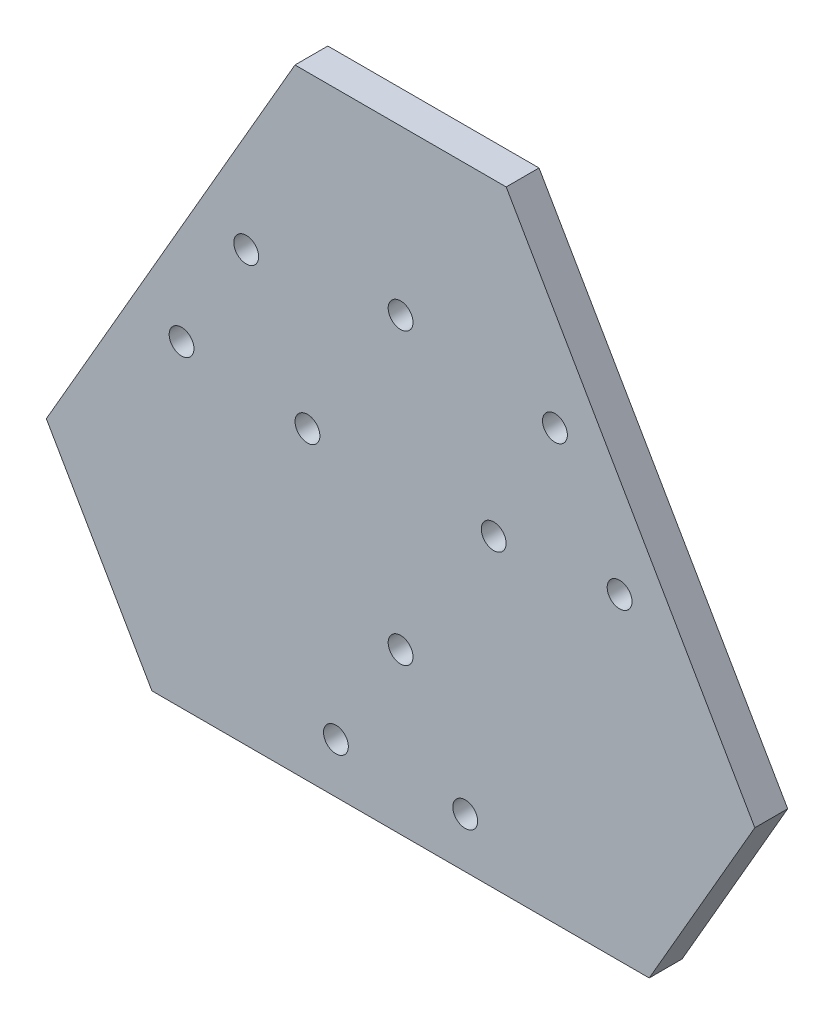
ISO-10303-21;
HEADER;
FILE_DESCRIPTION(('STEP AP214'),'2;1');
FILE_NAME('part.step','',(''),(''),'','','');
FILE_SCHEMA(('AUTOMOTIVE_DESIGN { 1 0 10303 214 1 1 1 1 }'));
ENDSEC;
DATA;
#1=APPLICATION_CONTEXT('core data for automotive mechanical design processes');
#2=APPLICATION_PROTOCOL_DEFINITION('international standard','automotive_design',2000,#1);
#3=PRODUCT_CONTEXT('',#1,'mechanical');
#4=PRODUCT('Part','Part','',(#3));
#5=PRODUCT_RELATED_PRODUCT_CATEGORY('part','',(#4));
#6=PRODUCT_DEFINITION_FORMATION('','',#4);
#7=PRODUCT_DEFINITION_CONTEXT('part definition',#1,'design');
#8=PRODUCT_DEFINITION('design','',#6,#7);
#9=PRODUCT_DEFINITION_SHAPE('','',#8);
#10=(LENGTH_UNIT() NAMED_UNIT(*) SI_UNIT(.MILLI.,.METRE.));
#11=(NAMED_UNIT(*) PLANE_ANGLE_UNIT() SI_UNIT($,.RADIAN.));
#12=(NAMED_UNIT(*) SI_UNIT($,.STERADIAN.) SOLID_ANGLE_UNIT());
#13=UNCERTAINTY_MEASURE_WITH_UNIT(LENGTH_MEASURE(1.E-05),#10,'distance_accuracy_value','');
#14=(GEOMETRIC_REPRESENTATION_CONTEXT(3) GLOBAL_UNCERTAINTY_ASSIGNED_CONTEXT((#13)) GLOBAL_UNIT_ASSIGNED_CONTEXT((#10,
#11,#12)) REPRESENTATION_CONTEXT('',''));
#15=CARTESIAN_POINT('',(0.,0.,0.));
#16=DIRECTION('',(0.,0.,1.));
#17=DIRECTION('',(1.,0.,0.));
#18=AXIS2_PLACEMENT_3D('',#15,#16,#17);
#19=CARTESIAN_POINT('',(88.9,-51.3264389309577,6.35));
#20=DIRECTION('',(0.,1.,0.));
#21=DIRECTION('',(-1.,0.,0.));
#22=AXIS2_PLACEMENT_3D('',#19,#20,#21);
#23=PLANE('',#22);
#24=DIRECTION('',(1.,0.,0.));
#25=VECTOR('',#24,1.);
#26=CARTESIAN_POINT('',(88.9,-51.3264389309577,0.));
#27=LINE('',#26,#25);
#28=CARTESIAN_POINT('',(-48.0682684614689,-51.326438930959,0.));
#29=VERTEX_POINT('',#28);
#30=CARTESIAN_POINT('',(48.0682684614717,-51.3264389309577,0.));
#31=VERTEX_POINT('',#30);
#32=EDGE_CURVE('E107',#29,#31,#27,.T.);
#33=ORIENTED_EDGE('',*,*,#32,.T.);
#34=DIRECTION('',(0.,0.,1.));
#35=VECTOR('',#34,1.);
#36=CARTESIAN_POINT('',(48.0682684614717,-51.3264389309573,0.));
#37=LINE('',#36,#35);
#38=CARTESIAN_POINT('',(48.0682684614717,-51.3264389309573,6.35));
#39=VERTEX_POINT('',#38);
#40=EDGE_CURVE('E123',#31,#39,#37,.T.);
#41=ORIENTED_EDGE('',*,*,#40,.T.);
#42=DIRECTION('',(1.,0.,0.));
#43=VECTOR('',#42,1.);
#44=CARTESIAN_POINT('',(88.9,-51.3264389309577,6.35));
#45=LINE('',#44,#43);
#46=CARTESIAN_POINT('',(-48.0682684614689,-51.326438930959,6.35));
#47=VERTEX_POINT('',#46);
#48=EDGE_CURVE('E103',#47,#39,#45,.T.);
#49=ORIENTED_EDGE('',*,*,#48,.F.);
#50=DIRECTION('',(0.,0.,1.));
#51=VECTOR('',#50,1.);
#52=CARTESIAN_POINT('',(-48.0682684614689,-51.326438930959,0.));
#53=LINE('',#52,#51);
#54=EDGE_CURVE('E116',#29,#47,#53,.T.);
#55=ORIENTED_EDGE('',*,*,#54,.F.);
#56=EDGE_LOOP('',(#33,#41,#49,#55));
#57=FACE_BOUND('',#56,.T.);
#58=ADVANCED_FACE('F33',(#57),#23,.F.);
#59=CARTESIAN_POINT('',(0.,102.652877861915,6.35));
#60=DIRECTION('',(-0.866025403784439,-0.5,0.));
#61=DIRECTION('',(0.5,-0.866025403784439,0.));
#62=AXIS2_PLACEMENT_3D('',#59,#60,#61);
#63=PLANE('',#62);
#64=DIRECTION('',(-0.5,0.866025403784439,0.));
#65=VECTOR('',#64,1.);
#66=CARTESIAN_POINT('',(0.,102.652877861915,0.));
#67=LINE('',#66,#65);
#68=CARTESIAN_POINT('',(68.484134230735,-15.9651221380849,0.));
#69=VERTEX_POINT('',#68);
#70=CARTESIAN_POINT('',(20.415865769265,67.2915610690423,0.));
#71=VERTEX_POINT('',#70);
#72=EDGE_CURVE('E104',#69,#71,#67,.T.);
#73=ORIENTED_EDGE('',*,*,#72,.T.);
#74=DIRECTION('',(0.,0.,1.));
#75=VECTOR('',#74,1.);
#76=CARTESIAN_POINT('',(20.415865769265,67.2915610690423,0.));
#77=LINE('',#76,#75);
#78=CARTESIAN_POINT('',(20.415865769265,67.2915610690423,6.35));
#79=VERTEX_POINT('',#78);
#80=EDGE_CURVE('E49',#71,#79,#77,.T.);
#81=ORIENTED_EDGE('',*,*,#80,.T.);
#82=DIRECTION('',(-0.5,0.866025403784439,0.));
#83=VECTOR('',#82,1.);
#84=CARTESIAN_POINT('',(0.,102.652877861915,6.35));
#85=LINE('',#84,#83);
#86=CARTESIAN_POINT('',(68.484134230735,-15.9651221380849,6.35));
#87=VERTEX_POINT('',#86);
#88=EDGE_CURVE('E41',#87,#79,#85,.T.);
#89=ORIENTED_EDGE('',*,*,#88,.F.);
#90=DIRECTION('',(0.,0.,1.));
#91=VECTOR('',#90,1.);
#92=CARTESIAN_POINT('',(68.484134230735,-15.9651221380849,0.));
#93=LINE('',#92,#91);
#94=EDGE_CURVE('E126',#69,#87,#93,.T.);
#95=ORIENTED_EDGE('',*,*,#94,.F.);
#96=EDGE_LOOP('',(#73,#81,#89,#95));
#97=FACE_BOUND('',#96,.T.);
#98=ADVANCED_FACE('F220',(#97),#63,.F.);
#99=CARTESIAN_POINT('',(-88.9,-51.3264389309577,6.35));
#100=DIRECTION('',(0.866025403784439,-0.5,0.));
#101=DIRECTION('',(0.5,0.866025403784439,0.));
#102=AXIS2_PLACEMENT_3D('',#99,#100,#101);
#103=PLANE('',#102);
#104=DIRECTION('',(-0.5,-0.866025403784439,0.));
#105=VECTOR('',#104,1.);
#106=CARTESIAN_POINT('',(-88.9,-51.3264389309577,6.35));
#107=LINE('',#106,#105);
#108=CARTESIAN_POINT('',(-20.415865769265,67.2915610690423,6.35));
#109=VERTEX_POINT('',#108);
#110=CARTESIAN_POINT('',(-68.4841342307339,-15.9651221380858,6.35));
#111=VERTEX_POINT('',#110);
#112=EDGE_CURVE('E11',#109,#111,#107,.T.);
#113=ORIENTED_EDGE('',*,*,#112,.F.);
#114=DIRECTION('',(0.,0.,1.));
#115=VECTOR('',#114,1.);
#116=CARTESIAN_POINT('',(-20.415865769265,67.2915610690423,0.));
#117=LINE('',#116,#115);
#118=CARTESIAN_POINT('',(-20.415865769265,67.2915610690423,0.));
#119=VERTEX_POINT('',#118);
#120=EDGE_CURVE('E87',#119,#109,#117,.T.);
#121=ORIENTED_EDGE('',*,*,#120,.F.);
#122=DIRECTION('',(-0.5,-0.866025403784439,0.));
#123=VECTOR('',#122,1.);
#124=CARTESIAN_POINT('',(-88.9,-51.3264389309577,0.));
#125=LINE('',#124,#123);
#126=CARTESIAN_POINT('',(-68.4841342307353,-15.965122138085,0.));
#127=VERTEX_POINT('',#126);
#128=EDGE_CURVE('E36',#119,#127,#125,.T.);
#129=ORIENTED_EDGE('',*,*,#128,.T.);
#130=DIRECTION('',(0.,0.,1.));
#131=VECTOR('',#130,1.);
#132=CARTESIAN_POINT('',(-68.4841342307339,-15.9651221380858,0.));
#133=LINE('',#132,#131);
#134=EDGE_CURVE('E57',#127,#111,#133,.T.);
#135=ORIENTED_EDGE('',*,*,#134,.T.);
#136=EDGE_LOOP('',(#113,#121,#129,#135));
#137=FACE_BOUND('',#136,.T.);
#138=ADVANCED_FACE('F98',(#137),#103,.F.);
#139=CARTESIAN_POINT('',(0.,0.,6.35));
#140=DIRECTION('',(0.,0.,-1.));
#141=DIRECTION('',(-1.,0.,0.));
#142=AXIS2_PLACEMENT_3D('',#139,#140,#141);
#143=PLANE('',#142);
#144=CARTESIAN_POINT('',(0.,35.6048,6.35));
#145=DIRECTION('',(0.,0.,1.));
#146=DIRECTION('',(1.,0.,0.));
#147=AXIS2_PLACEMENT_3D('',#144,#145,#146);
#148=CIRCLE('',#147,2.39999999999999);
#149=CARTESIAN_POINT('',(2.39999999999999,35.6048,6.35));
#150=VERTEX_POINT('',#149);
#151=EDGE_CURVE('E190',#150,#150,#148,.T.);
#152=ORIENTED_EDGE('',*,*,#151,.F.);
#153=EDGE_LOOP('',(#152));
#154=FACE_BOUND('',#153,.T.);
#155=CARTESIAN_POINT('',(0.,-20.3952,6.35));
#156=DIRECTION('',(0.,0.,1.));
#157=DIRECTION('',(1.,0.,0.));
#158=AXIS2_PLACEMENT_3D('',#155,#156,#157);
#159=CIRCLE('',#158,2.39999999999999);
#160=CARTESIAN_POINT('',(2.39999999999999,-20.3952,6.35));
#161=VERTEX_POINT('',#160);
#162=EDGE_CURVE('E184',#161,#161,#159,.T.);
#163=ORIENTED_EDGE('',*,*,#162,.F.);
#164=EDGE_LOOP('',(#163));
#165=FACE_BOUND('',#164,.T.);
#166=CARTESIAN_POINT('',(18.,7.6048,6.35));
#167=DIRECTION('',(0.,0.,1.));
#168=DIRECTION('',(1.,0.,0.));
#169=AXIS2_PLACEMENT_3D('',#166,#167,#168);
#170=CIRCLE('',#169,2.39999999999999);
#171=CARTESIAN_POINT('',(20.4,7.6048,6.35));
#172=VERTEX_POINT('',#171);
#173=EDGE_CURVE('E178',#172,#172,#170,.T.);
#174=ORIENTED_EDGE('',*,*,#173,.F.);
#175=EDGE_LOOP('',(#174));
#176=FACE_BOUND('',#175,.T.);
#177=CARTESIAN_POINT('',(-18.,7.6048,6.35));
#178=DIRECTION('',(0.,0.,1.));
#179=DIRECTION('',(1.,0.,0.));
#180=AXIS2_PLACEMENT_3D('',#177,#178,#179);
#181=CIRCLE('',#180,2.39999999999999);
#182=CARTESIAN_POINT('',(-15.6,7.6048,6.35));
#183=VERTEX_POINT('',#182);
#184=EDGE_CURVE('E172',#183,#183,#181,.T.);
#185=ORIENTED_EDGE('',*,*,#184,.F.);
#186=EDGE_LOOP('',(#185));
#187=FACE_BOUND('',#186,.T.);
#188=CARTESIAN_POINT('',(12.5,-41.674438930959,6.35));
#189=DIRECTION('',(0.,0.,1.));
#190=DIRECTION('',(1.,0.,0.));
#191=AXIS2_PLACEMENT_3D('',#188,#189,#190);
#192=CIRCLE('',#191,2.4);
#193=CARTESIAN_POINT('',(14.9,-41.674438930959,6.35));
#194=VERTEX_POINT('',#193);
#195=EDGE_CURVE('E166',#194,#194,#192,.T.);
#196=ORIENTED_EDGE('',*,*,#195,.F.);
#197=EDGE_LOOP('',(#196));
#198=FACE_BOUND('',#197,.T.);
#199=CARTESIAN_POINT('',(-12.5,-41.674438930959,6.35));
#200=DIRECTION('',(0.,0.,1.));
#201=DIRECTION('',(1.,0.,0.));
#202=AXIS2_PLACEMENT_3D('',#199,#200,#201);
#203=CIRCLE('',#202,2.4);
#204=CARTESIAN_POINT('',(-10.1,-41.674438930959,6.35));
#205=VERTEX_POINT('',#204);
#206=EDGE_CURVE('E160',#205,#205,#203,.T.);
#207=ORIENTED_EDGE('',*,*,#206,.F.);
#208=EDGE_LOOP('',(#207));
#209=FACE_BOUND('',#208,.T.);
#210=CARTESIAN_POINT('',(-42.3411228026736,10.0119019181742,6.35));
#211=DIRECTION('',(0.,0.,1.));
#212=DIRECTION('',(1.,0.,0.));
#213=AXIS2_PLACEMENT_3D('',#210,#211,#212);
#214=CIRCLE('',#213,2.4);
#215=CARTESIAN_POINT('',(-39.9411228026736,10.0119019181742,6.35));
#216=VERTEX_POINT('',#215);
#217=EDGE_CURVE('E154',#216,#216,#214,.T.);
#218=ORIENTED_EDGE('',*,*,#217,.F.);
#219=EDGE_LOOP('',(#218));
#220=FACE_BOUND('',#219,.T.);
#221=CARTESIAN_POINT('',(-29.8411228026735,31.6625370127851,6.35));
#222=DIRECTION('',(0.,0.,1.));
#223=DIRECTION('',(1.,0.,0.));
#224=AXIS2_PLACEMENT_3D('',#221,#222,#223);
#225=CIRCLE('',#224,2.4);
#226=CARTESIAN_POINT('',(-27.4411228026735,31.6625370127851,6.35));
#227=VERTEX_POINT('',#226);
#228=EDGE_CURVE('E148',#227,#227,#225,.T.);
#229=ORIENTED_EDGE('',*,*,#228,.F.);
#230=EDGE_LOOP('',(#229));
#231=FACE_BOUND('',#230,.T.);
#232=CARTESIAN_POINT('',(29.841122802674,31.6625370127847,6.35));
#233=DIRECTION('',(0.,0.,1.));
#234=DIRECTION('',(1.,0.,0.));
#235=AXIS2_PLACEMENT_3D('',#232,#233,#234);
#236=CIRCLE('',#235,2.4);
#237=CARTESIAN_POINT('',(32.241122802674,31.6625370127847,6.35));
#238=VERTEX_POINT('',#237);
#239=EDGE_CURVE('E142',#238,#238,#236,.T.);
#240=ORIENTED_EDGE('',*,*,#239,.F.);
#241=EDGE_LOOP('',(#240));
#242=FACE_BOUND('',#241,.T.);
#243=CARTESIAN_POINT('',(42.3411228026738,10.0119019181736,6.35));
#244=DIRECTION('',(0.,0.,1.));
#245=DIRECTION('',(1.,0.,0.));
#246=AXIS2_PLACEMENT_3D('',#243,#244,#245);
#247=CIRCLE('',#246,2.4);
#248=CARTESIAN_POINT('',(44.7411228026738,10.0119019181736,6.35));
#249=VERTEX_POINT('',#248);
#250=EDGE_CURVE('E136',#249,#249,#247,.T.);
#251=ORIENTED_EDGE('',*,*,#250,.F.);
#252=EDGE_LOOP('',(#251));
#253=FACE_BOUND('',#252,.T.);
#254=ORIENTED_EDGE('',*,*,#88,.T.);
#255=DIRECTION('',(1.,0.,0.));
#256=VECTOR('',#255,1.);
#257=CARTESIAN_POINT('',(-20.415865769265,67.2915610690423,6.35));
#258=LINE('',#257,#256);
#259=EDGE_CURVE('E93',#109,#79,#258,.T.);
#260=ORIENTED_EDGE('',*,*,#259,.F.);
#261=ORIENTED_EDGE('',*,*,#112,.T.);
#262=DIRECTION('',(-0.500000000000001,0.866025403784438,0.));
#263=VECTOR('',#262,1.);
#264=CARTESIAN_POINT('',(-48.0682684614689,-51.326438930959,6.35));
#265=LINE('',#264,#263);
#266=EDGE_CURVE('E119',#47,#111,#265,.T.);
#267=ORIENTED_EDGE('',*,*,#266,.F.);
#268=ORIENTED_EDGE('',*,*,#48,.T.);
#269=DIRECTION('',(-0.499999999999976,-0.866025403784452,0.));
#270=VECTOR('',#269,1.);
#271=CARTESIAN_POINT('',(68.484134230735,-15.9651221380849,6.35));
#272=LINE('',#271,#270);
#273=EDGE_CURVE('E118',#87,#39,#272,.T.);
#274=ORIENTED_EDGE('',*,*,#273,.F.);
#275=EDGE_LOOP('',(#254,#260,#261,#267,#268,#274));
#276=FACE_BOUND('',#275,.T.);
#277=ADVANCED_FACE('F196',(#154,#165,#176,#187,#198,#209,#220,#231,#242,#253,#276),#143,.F.);
#278=CARTESIAN_POINT('',(0.,0.,0.));
#279=DIRECTION('',(0.,0.,-1.));
#280=DIRECTION('',(-1.,0.,0.));
#281=AXIS2_PLACEMENT_3D('',#278,#279,#280);
#282=PLANE('',#281);
#283=CARTESIAN_POINT('',(0.,35.6048,0.));
#284=DIRECTION('',(0.,0.,1.));
#285=DIRECTION('',(1.,0.,0.));
#286=AXIS2_PLACEMENT_3D('',#283,#284,#285);
#287=CIRCLE('',#286,2.39999999999999);
#288=CARTESIAN_POINT('',(2.39999999999999,35.6048,0.));
#289=VERTEX_POINT('',#288);
#290=EDGE_CURVE('E187',#289,#289,#287,.T.);
#291=ORIENTED_EDGE('',*,*,#290,.T.);
#292=EDGE_LOOP('',(#291));
#293=FACE_BOUND('',#292,.T.);
#294=CARTESIAN_POINT('',(0.,-20.3952,0.));
#295=DIRECTION('',(0.,0.,1.));
#296=DIRECTION('',(1.,0.,0.));
#297=AXIS2_PLACEMENT_3D('',#294,#295,#296);
#298=CIRCLE('',#297,2.39999999999999);
#299=CARTESIAN_POINT('',(2.39999999999999,-20.3952,0.));
#300=VERTEX_POINT('',#299);
#301=EDGE_CURVE('E181',#300,#300,#298,.T.);
#302=ORIENTED_EDGE('',*,*,#301,.T.);
#303=EDGE_LOOP('',(#302));
#304=FACE_BOUND('',#303,.T.);
#305=CARTESIAN_POINT('',(18.,7.6048,0.));
#306=DIRECTION('',(0.,0.,1.));
#307=DIRECTION('',(1.,0.,0.));
#308=AXIS2_PLACEMENT_3D('',#305,#306,#307);
#309=CIRCLE('',#308,2.39999999999999);
#310=CARTESIAN_POINT('',(20.4,7.6048,0.));
#311=VERTEX_POINT('',#310);
#312=EDGE_CURVE('E175',#311,#311,#309,.T.);
#313=ORIENTED_EDGE('',*,*,#312,.T.);
#314=EDGE_LOOP('',(#313));
#315=FACE_BOUND('',#314,.T.);
#316=CARTESIAN_POINT('',(-18.,7.6048,0.));
#317=DIRECTION('',(0.,0.,1.));
#318=DIRECTION('',(1.,0.,0.));
#319=AXIS2_PLACEMENT_3D('',#316,#317,#318);
#320=CIRCLE('',#319,2.39999999999999);
#321=CARTESIAN_POINT('',(-15.6,7.6048,0.));
#322=VERTEX_POINT('',#321);
#323=EDGE_CURVE('E169',#322,#322,#320,.T.);
#324=ORIENTED_EDGE('',*,*,#323,.T.);
#325=EDGE_LOOP('',(#324));
#326=FACE_BOUND('',#325,.T.);
#327=CARTESIAN_POINT('',(12.5,-41.674438930959,0.));
#328=DIRECTION('',(0.,0.,1.));
#329=DIRECTION('',(1.,0.,0.));
#330=AXIS2_PLACEMENT_3D('',#327,#328,#329);
#331=CIRCLE('',#330,2.4);
#332=CARTESIAN_POINT('',(14.9,-41.674438930959,0.));
#333=VERTEX_POINT('',#332);
#334=EDGE_CURVE('E163',#333,#333,#331,.T.);
#335=ORIENTED_EDGE('',*,*,#334,.T.);
#336=EDGE_LOOP('',(#335));
#337=FACE_BOUND('',#336,.T.);
#338=CARTESIAN_POINT('',(-12.5,-41.674438930959,0.));
#339=DIRECTION('',(0.,0.,1.));
#340=DIRECTION('',(1.,0.,0.));
#341=AXIS2_PLACEMENT_3D('',#338,#339,#340);
#342=CIRCLE('',#341,2.4);
#343=CARTESIAN_POINT('',(-10.1,-41.674438930959,0.));
#344=VERTEX_POINT('',#343);
#345=EDGE_CURVE('E157',#344,#344,#342,.T.);
#346=ORIENTED_EDGE('',*,*,#345,.T.);
#347=EDGE_LOOP('',(#346));
#348=FACE_BOUND('',#347,.T.);
#349=CARTESIAN_POINT('',(-42.3411228026736,10.0119019181742,0.));
#350=DIRECTION('',(0.,0.,1.));
#351=DIRECTION('',(1.,0.,0.));
#352=AXIS2_PLACEMENT_3D('',#349,#350,#351);
#353=CIRCLE('',#352,2.4);
#354=CARTESIAN_POINT('',(-39.9411228026736,10.0119019181742,0.));
#355=VERTEX_POINT('',#354);
#356=EDGE_CURVE('E151',#355,#355,#353,.T.);
#357=ORIENTED_EDGE('',*,*,#356,.T.);
#358=EDGE_LOOP('',(#357));
#359=FACE_BOUND('',#358,.T.);
#360=CARTESIAN_POINT('',(-29.8411228026735,31.6625370127851,0.));
#361=DIRECTION('',(0.,0.,1.));
#362=DIRECTION('',(1.,0.,0.));
#363=AXIS2_PLACEMENT_3D('',#360,#361,#362);
#364=CIRCLE('',#363,2.4);
#365=CARTESIAN_POINT('',(-27.4411228026735,31.6625370127851,0.));
#366=VERTEX_POINT('',#365);
#367=EDGE_CURVE('E145',#366,#366,#364,.T.);
#368=ORIENTED_EDGE('',*,*,#367,.T.);
#369=EDGE_LOOP('',(#368));
#370=FACE_BOUND('',#369,.T.);
#371=CARTESIAN_POINT('',(29.841122802674,31.6625370127847,0.));
#372=DIRECTION('',(0.,0.,1.));
#373=DIRECTION('',(1.,0.,0.));
#374=AXIS2_PLACEMENT_3D('',#371,#372,#373);
#375=CIRCLE('',#374,2.4);
#376=CARTESIAN_POINT('',(32.241122802674,31.6625370127847,0.));
#377=VERTEX_POINT('',#376);
#378=EDGE_CURVE('E139',#377,#377,#375,.T.);
#379=ORIENTED_EDGE('',*,*,#378,.T.);
#380=EDGE_LOOP('',(#379));
#381=FACE_BOUND('',#380,.T.);
#382=CARTESIAN_POINT('',(42.3411228026738,10.0119019181736,0.));
#383=DIRECTION('',(0.,0.,1.));
#384=DIRECTION('',(1.,0.,0.));
#385=AXIS2_PLACEMENT_3D('',#382,#383,#384);
#386=CIRCLE('',#385,2.4);
#387=CARTESIAN_POINT('',(44.7411228026738,10.0119019181736,0.));
#388=VERTEX_POINT('',#387);
#389=EDGE_CURVE('E121',#388,#388,#386,.T.);
#390=ORIENTED_EDGE('',*,*,#389,.T.);
#391=EDGE_LOOP('',(#390));
#392=FACE_BOUND('',#391,.T.);
#393=DIRECTION('',(1.,0.,0.));
#394=VECTOR('',#393,1.);
#395=CARTESIAN_POINT('',(-20.415865769265,67.2915610690423,0.));
#396=LINE('',#395,#394);
#397=EDGE_CURVE('E84',#119,#71,#396,.T.);
#398=ORIENTED_EDGE('',*,*,#397,.T.);
#399=ORIENTED_EDGE('',*,*,#72,.F.);
#400=DIRECTION('',(-0.499999999999976,-0.866025403784452,0.));
#401=VECTOR('',#400,1.);
#402=CARTESIAN_POINT('',(68.484134230735,-15.9651221380849,0.));
#403=LINE('',#402,#401);
#404=EDGE_CURVE('E127',#69,#31,#403,.T.);
#405=ORIENTED_EDGE('',*,*,#404,.T.);
#406=ORIENTED_EDGE('',*,*,#32,.F.);
#407=DIRECTION('',(-0.500000000000001,0.866025403784438,0.));
#408=VECTOR('',#407,1.);
#409=CARTESIAN_POINT('',(-48.0682684614689,-51.326438930959,0.));
#410=LINE('',#409,#408);
#411=EDGE_CURVE('E102',#29,#127,#410,.T.);
#412=ORIENTED_EDGE('',*,*,#411,.T.);
#413=ORIENTED_EDGE('',*,*,#128,.F.);
#414=EDGE_LOOP('',(#398,#399,#405,#406,#412,#413));
#415=FACE_BOUND('',#414,.T.);
#416=ADVANCED_FACE('F100',(#293,#304,#315,#326,#337,#348,#359,#370,#381,#392,#415),#282,.T.);
#417=CARTESIAN_POINT('',(-48.0682684614689,-51.326438930959,0.));
#418=DIRECTION('',(0.866025403784438,0.500000000000001,0.));
#419=DIRECTION('',(-0.500000000000001,0.866025403784438,0.));
#420=AXIS2_PLACEMENT_3D('',#417,#418,#419);
#421=PLANE('',#420);
#422=ORIENTED_EDGE('',*,*,#266,.T.);
#423=ORIENTED_EDGE('',*,*,#134,.F.);
#424=ORIENTED_EDGE('',*,*,#411,.F.);
#425=ORIENTED_EDGE('',*,*,#54,.T.);
#426=EDGE_LOOP('',(#422,#423,#424,#425));
#427=FACE_BOUND('',#426,.T.);
#428=ADVANCED_FACE('F226',(#427),#421,.F.);
#429=CARTESIAN_POINT('',(68.484134230735,-15.9651221380849,0.));
#430=DIRECTION('',(-0.866025403784452,0.499999999999976,0.));
#431=DIRECTION('',(-0.499999999999976,-0.866025403784452,0.));
#432=AXIS2_PLACEMENT_3D('',#429,#430,#431);
#433=PLANE('',#432);
#434=ORIENTED_EDGE('',*,*,#273,.T.);
#435=ORIENTED_EDGE('',*,*,#40,.F.);
#436=ORIENTED_EDGE('',*,*,#404,.F.);
#437=ORIENTED_EDGE('',*,*,#94,.T.);
#438=EDGE_LOOP('',(#434,#435,#436,#437));
#439=FACE_BOUND('',#438,.T.);
#440=ADVANCED_FACE('F228',(#439),#433,.F.);
#441=CARTESIAN_POINT('',(-20.415865769265,67.2915610690423,0.));
#442=DIRECTION('',(0.,-1.,0.));
#443=DIRECTION('',(0.,0.,-1.));
#444=AXIS2_PLACEMENT_3D('',#441,#442,#443);
#445=PLANE('',#444);
#446=ORIENTED_EDGE('',*,*,#259,.T.);
#447=ORIENTED_EDGE('',*,*,#80,.F.);
#448=ORIENTED_EDGE('',*,*,#397,.F.);
#449=ORIENTED_EDGE('',*,*,#120,.T.);
#450=EDGE_LOOP('',(#446,#447,#448,#449));
#451=FACE_BOUND('',#450,.T.);
#452=ADVANCED_FACE('F86',(#451),#445,.F.);
#453=CARTESIAN_POINT('',(42.3411228026738,10.0119019181736,6.35));
#454=DIRECTION('',(0.,0.,1.));
#455=DIRECTION('',(1.,0.,0.));
#456=AXIS2_PLACEMENT_3D('',#453,#454,#455);
#457=CYLINDRICAL_SURFACE('',#456,2.4);
#458=ORIENTED_EDGE('',*,*,#389,.F.);
#459=EDGE_LOOP('',(#458));
#460=FACE_BOUND('',#459,.T.);
#461=ORIENTED_EDGE('',*,*,#250,.T.);
#462=EDGE_LOOP('',(#461));
#463=FACE_BOUND('',#462,.T.);
#464=ADVANCED_FACE('F322',(#460,#463),#457,.F.);
#465=CARTESIAN_POINT('',(29.841122802674,31.6625370127847,6.35));
#466=DIRECTION('',(0.,0.,1.));
#467=DIRECTION('',(1.,0.,0.));
#468=AXIS2_PLACEMENT_3D('',#465,#466,#467);
#469=CYLINDRICAL_SURFACE('',#468,2.4);
#470=ORIENTED_EDGE('',*,*,#378,.F.);
#471=EDGE_LOOP('',(#470));
#472=FACE_BOUND('',#471,.T.);
#473=ORIENTED_EDGE('',*,*,#239,.T.);
#474=EDGE_LOOP('',(#473));
#475=FACE_BOUND('',#474,.T.);
#476=ADVANCED_FACE('F318',(#472,#475),#469,.F.);
#477=CARTESIAN_POINT('',(-29.8411228026735,31.6625370127851,6.35));
#478=DIRECTION('',(0.,0.,1.));
#479=DIRECTION('',(1.,0.,0.));
#480=AXIS2_PLACEMENT_3D('',#477,#478,#479);
#481=CYLINDRICAL_SURFACE('',#480,2.4);
#482=ORIENTED_EDGE('',*,*,#367,.F.);
#483=EDGE_LOOP('',(#482));
#484=FACE_BOUND('',#483,.T.);
#485=ORIENTED_EDGE('',*,*,#228,.T.);
#486=EDGE_LOOP('',(#485));
#487=FACE_BOUND('',#486,.T.);
#488=ADVANCED_FACE('F314',(#484,#487),#481,.F.);
#489=CARTESIAN_POINT('',(-42.3411228026736,10.0119019181742,6.35));
#490=DIRECTION('',(0.,0.,1.));
#491=DIRECTION('',(1.,0.,0.));
#492=AXIS2_PLACEMENT_3D('',#489,#490,#491);
#493=CYLINDRICAL_SURFACE('',#492,2.4);
#494=ORIENTED_EDGE('',*,*,#356,.F.);
#495=EDGE_LOOP('',(#494));
#496=FACE_BOUND('',#495,.T.);
#497=ORIENTED_EDGE('',*,*,#217,.T.);
#498=EDGE_LOOP('',(#497));
#499=FACE_BOUND('',#498,.T.);
#500=ADVANCED_FACE('F310',(#496,#499),#493,.F.);
#501=CARTESIAN_POINT('',(-12.5,-41.674438930959,6.35));
#502=DIRECTION('',(0.,0.,1.));
#503=DIRECTION('',(1.,0.,0.));
#504=AXIS2_PLACEMENT_3D('',#501,#502,#503);
#505=CYLINDRICAL_SURFACE('',#504,2.4);
#506=ORIENTED_EDGE('',*,*,#345,.F.);
#507=EDGE_LOOP('',(#506));
#508=FACE_BOUND('',#507,.T.);
#509=ORIENTED_EDGE('',*,*,#206,.T.);
#510=EDGE_LOOP('',(#509));
#511=FACE_BOUND('',#510,.T.);
#512=ADVANCED_FACE('F306',(#508,#511),#505,.F.);
#513=CARTESIAN_POINT('',(12.5,-41.674438930959,6.35));
#514=DIRECTION('',(0.,0.,1.));
#515=DIRECTION('',(1.,0.,0.));
#516=AXIS2_PLACEMENT_3D('',#513,#514,#515);
#517=CYLINDRICAL_SURFACE('',#516,2.4);
#518=ORIENTED_EDGE('',*,*,#334,.F.);
#519=EDGE_LOOP('',(#518));
#520=FACE_BOUND('',#519,.T.);
#521=ORIENTED_EDGE('',*,*,#195,.T.);
#522=EDGE_LOOP('',(#521));
#523=FACE_BOUND('',#522,.T.);
#524=ADVANCED_FACE('F268',(#520,#523),#517,.F.);
#525=CARTESIAN_POINT('',(-18.,7.6048,6.35));
#526=DIRECTION('',(0.,0.,1.));
#527=DIRECTION('',(1.,0.,0.));
#528=AXIS2_PLACEMENT_3D('',#525,#526,#527);
#529=CYLINDRICAL_SURFACE('',#528,2.39999999999999);
#530=ORIENTED_EDGE('',*,*,#323,.F.);
#531=EDGE_LOOP('',(#530));
#532=FACE_BOUND('',#531,.T.);
#533=ORIENTED_EDGE('',*,*,#184,.T.);
#534=EDGE_LOOP('',(#533));
#535=FACE_BOUND('',#534,.T.);
#536=ADVANCED_FACE('F262',(#532,#535),#529,.F.);
#537=CARTESIAN_POINT('',(18.,7.6048,6.35));
#538=DIRECTION('',(0.,0.,1.));
#539=DIRECTION('',(1.,0.,0.));
#540=AXIS2_PLACEMENT_3D('',#537,#538,#539);
#541=CYLINDRICAL_SURFACE('',#540,2.39999999999999);
#542=ORIENTED_EDGE('',*,*,#312,.F.);
#543=EDGE_LOOP('',(#542));
#544=FACE_BOUND('',#543,.T.);
#545=ORIENTED_EDGE('',*,*,#173,.T.);
#546=EDGE_LOOP('',(#545));
#547=FACE_BOUND('',#546,.T.);
#548=ADVANCED_FACE('F267',(#544,#547),#541,.F.);
#549=CARTESIAN_POINT('',(0.,-20.3952,6.35));
#550=DIRECTION('',(0.,0.,1.));
#551=DIRECTION('',(1.,0.,0.));
#552=AXIS2_PLACEMENT_3D('',#549,#550,#551);
#553=CYLINDRICAL_SURFACE('',#552,2.39999999999999);
#554=ORIENTED_EDGE('',*,*,#301,.F.);
#555=EDGE_LOOP('',(#554));
#556=FACE_BOUND('',#555,.T.);
#557=ORIENTED_EDGE('',*,*,#162,.T.);
#558=EDGE_LOOP('',(#557));
#559=FACE_BOUND('',#558,.T.);
#560=ADVANCED_FACE('F280',(#556,#559),#553,.F.);
#561=CARTESIAN_POINT('',(0.,35.6048,6.35));
#562=DIRECTION('',(0.,0.,1.));
#563=DIRECTION('',(1.,0.,0.));
#564=AXIS2_PLACEMENT_3D('',#561,#562,#563);
#565=CYLINDRICAL_SURFACE('',#564,2.39999999999999);
#566=ORIENTED_EDGE('',*,*,#290,.F.);
#567=EDGE_LOOP('',(#566));
#568=FACE_BOUND('',#567,.T.);
#569=ORIENTED_EDGE('',*,*,#151,.T.);
#570=EDGE_LOOP('',(#569));
#571=FACE_BOUND('',#570,.T.);
#572=ADVANCED_FACE('F194',(#568,#571),#565,.F.);
#573=CLOSED_SHELL('',(#58,#98,#138,#277,#416,#428,#440,#452,#464,#476,#488,#500,#512,#524,#536,
#548,#560,#572));
#574=MANIFOLD_SOLID_BREP('B2',#573);
#575=ADVANCED_BREP_SHAPE_REPRESENTATION('',(#18,#574),#14);
#576=SHAPE_DEFINITION_REPRESENTATION(#9,#575);
ENDSEC;
END-ISO-10303-21;
